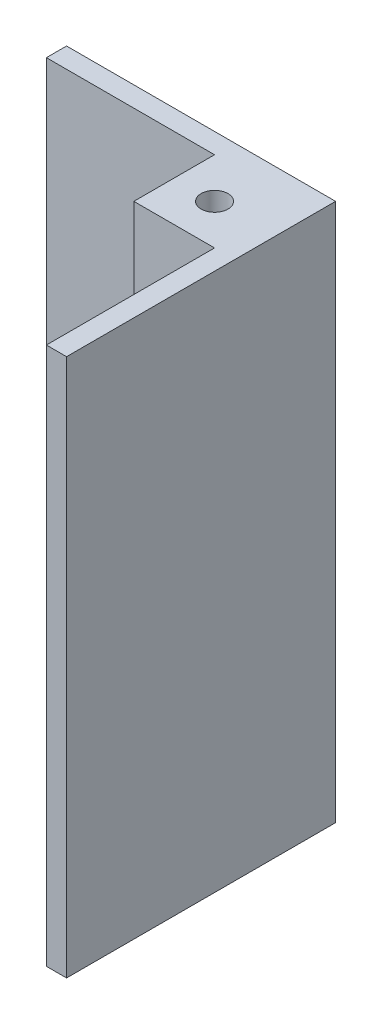
ISO-10303-21;
HEADER;
FILE_DESCRIPTION(('STEP AP214'),'2;1');
FILE_NAME('part.step','',(''),(''),'','','');
FILE_SCHEMA(('AUTOMOTIVE_DESIGN { 1 0 10303 214 1 1 1 1 }'));
ENDSEC;
DATA;
#1=APPLICATION_CONTEXT('core data for automotive mechanical design processes');
#2=APPLICATION_PROTOCOL_DEFINITION('international standard','automotive_design',2000,#1);
#3=PRODUCT_CONTEXT('',#1,'mechanical');
#4=PRODUCT('Part','Part','',(#3));
#5=PRODUCT_RELATED_PRODUCT_CATEGORY('part','',(#4));
#6=PRODUCT_DEFINITION_FORMATION('','',#4);
#7=PRODUCT_DEFINITION_CONTEXT('part definition',#1,'design');
#8=PRODUCT_DEFINITION('design','',#6,#7);
#9=PRODUCT_DEFINITION_SHAPE('','',#8);
#10=(LENGTH_UNIT() NAMED_UNIT(*) SI_UNIT(.MILLI.,.METRE.));
#11=(NAMED_UNIT(*) PLANE_ANGLE_UNIT() SI_UNIT($,.RADIAN.));
#12=(NAMED_UNIT(*) SI_UNIT($,.STERADIAN.) SOLID_ANGLE_UNIT());
#13=UNCERTAINTY_MEASURE_WITH_UNIT(LENGTH_MEASURE(1.E-05),#10,'distance_accuracy_value','');
#14=(GEOMETRIC_REPRESENTATION_CONTEXT(3) GLOBAL_UNCERTAINTY_ASSIGNED_CONTEXT((#13)) GLOBAL_UNIT_ASSIGNED_CONTEXT((#10,
#11,#12)) REPRESENTATION_CONTEXT('',''));
#15=CARTESIAN_POINT('',(0.,0.,0.));
#16=DIRECTION('',(0.,0.,1.));
#17=DIRECTION('',(1.,0.,0.));
#18=AXIS2_PLACEMENT_3D('',#15,#16,#17);
#19=CARTESIAN_POINT('',(0.,40.,0.));
#20=DIRECTION('',(1.,0.,0.));
#21=DIRECTION('',(0.,0.,-1.));
#22=AXIS2_PLACEMENT_3D('',#19,#20,#21);
#23=PLANE('',#22);
#24=DIRECTION('',(0.,0.,1.));
#25=VECTOR('',#24,1.);
#26=CARTESIAN_POINT('',(0.,0.,0.));
#27=LINE('',#26,#25);
#28=CARTESIAN_POINT('',(0.,0.,0.));
#29=VERTEX_POINT('',#28);
#30=CARTESIAN_POINT('',(0.,0.,1.5));
#31=VERTEX_POINT('',#30);
#32=EDGE_CURVE('E109',#29,#31,#27,.T.);
#33=ORIENTED_EDGE('',*,*,#32,.T.);
#34=DIRECTION('',(0.,-1.,0.));
#35=VECTOR('',#34,1.);
#36=CARTESIAN_POINT('',(0.,40.,1.5));
#37=LINE('',#36,#35);
#38=CARTESIAN_POINT('',(0.,40.,1.5));
#39=VERTEX_POINT('',#38);
#40=EDGE_CURVE('E11',#39,#31,#37,.T.);
#41=ORIENTED_EDGE('',*,*,#40,.F.);
#42=DIRECTION('',(0.,0.,1.));
#43=VECTOR('',#42,1.);
#44=CARTESIAN_POINT('',(0.,40.,0.));
#45=LINE('',#44,#43);
#46=CARTESIAN_POINT('',(0.,40.,0.));
#47=VERTEX_POINT('',#46);
#48=EDGE_CURVE('E111',#47,#39,#45,.T.);
#49=ORIENTED_EDGE('',*,*,#48,.F.);
#50=DIRECTION('',(0.,-1.,0.));
#51=VECTOR('',#50,1.);
#52=CARTESIAN_POINT('',(0.,40.,0.));
#53=LINE('',#52,#51);
#54=EDGE_CURVE('E124',#47,#29,#53,.T.);
#55=ORIENTED_EDGE('',*,*,#54,.T.);
#56=EDGE_LOOP('',(#33,#41,#49,#55));
#57=FACE_BOUND('',#56,.T.);
#58=ADVANCED_FACE('F16',(#57),#23,.F.);
#59=CARTESIAN_POINT('',(0.,40.,1.5));
#60=DIRECTION('',(0.,0.,-1.));
#61=DIRECTION('',(-1.,0.,0.));
#62=AXIS2_PLACEMENT_3D('',#59,#60,#61);
#63=PLANE('',#62);
#64=DIRECTION('',(1.,0.,0.));
#65=VECTOR('',#64,1.);
#66=CARTESIAN_POINT('',(0.,0.,1.5));
#67=LINE('',#66,#65);
#68=CARTESIAN_POINT('',(12.5,0.,1.5));
#69=VERTEX_POINT('',#68);
#70=EDGE_CURVE('E127',#31,#69,#67,.T.);
#71=ORIENTED_EDGE('',*,*,#70,.T.);
#72=DIRECTION('',(0.,1.,0.));
#73=VECTOR('',#72,1.);
#74=CARTESIAN_POINT('',(12.5,0.,1.5));
#75=LINE('',#74,#73);
#76=CARTESIAN_POINT('',(12.5,40.,1.5));
#77=VERTEX_POINT('',#76);
#78=EDGE_CURVE('E38',#69,#77,#75,.T.);
#79=ORIENTED_EDGE('',*,*,#78,.T.);
#80=DIRECTION('',(1.,0.,0.));
#81=VECTOR('',#80,1.);
#82=CARTESIAN_POINT('',(0.,40.,1.5));
#83=LINE('',#82,#81);
#84=EDGE_CURVE('E114',#39,#77,#83,.T.);
#85=ORIENTED_EDGE('',*,*,#84,.F.);
#86=ORIENTED_EDGE('',*,*,#40,.T.);
#87=EDGE_LOOP('',(#71,#79,#85,#86));
#88=FACE_BOUND('',#87,.T.);
#89=ADVANCED_FACE('F162',(#88),#63,.F.);
#90=CARTESIAN_POINT('',(18.5,40.,1.5));
#91=DIRECTION('',(1.,0.,0.));
#92=DIRECTION('',(0.,0.,-1.));
#93=AXIS2_PLACEMENT_3D('',#90,#91,#92);
#94=PLANE('',#93);
#95=DIRECTION('',(0.,0.,1.));
#96=VECTOR('',#95,1.);
#97=CARTESIAN_POINT('',(18.5,40.,1.5));
#98=LINE('',#97,#96);
#99=CARTESIAN_POINT('',(18.5,40.,7.5));
#100=VERTEX_POINT('',#99);
#101=CARTESIAN_POINT('',(18.5,40.,20.));
#102=VERTEX_POINT('',#101);
#103=EDGE_CURVE('E30',#100,#102,#98,.T.);
#104=ORIENTED_EDGE('',*,*,#103,.F.);
#105=DIRECTION('',(0.,1.,0.));
#106=VECTOR('',#105,1.);
#107=CARTESIAN_POINT('',(18.5,0.,7.5));
#108=LINE('',#107,#106);
#109=CARTESIAN_POINT('',(18.5,0.,7.5));
#110=VERTEX_POINT('',#109);
#111=EDGE_CURVE('E90',#110,#100,#108,.T.);
#112=ORIENTED_EDGE('',*,*,#111,.F.);
#113=DIRECTION('',(0.,0.,1.));
#114=VECTOR('',#113,1.);
#115=CARTESIAN_POINT('',(18.5,0.,1.5));
#116=LINE('',#115,#114);
#117=CARTESIAN_POINT('',(18.5,0.,20.));
#118=VERTEX_POINT('',#117);
#119=EDGE_CURVE('E100',#110,#118,#116,.T.);
#120=ORIENTED_EDGE('',*,*,#119,.T.);
#121=DIRECTION('',(0.,-1.,0.));
#122=VECTOR('',#121,1.);
#123=CARTESIAN_POINT('',(18.5,40.,20.));
#124=LINE('',#123,#122);
#125=EDGE_CURVE('E23',#102,#118,#124,.T.);
#126=ORIENTED_EDGE('',*,*,#125,.F.);
#127=EDGE_LOOP('',(#104,#112,#120,#126));
#128=FACE_BOUND('',#127,.T.);
#129=ADVANCED_FACE('F170',(#128),#94,.F.);
#130=CARTESIAN_POINT('',(18.5,40.,20.));
#131=DIRECTION('',(0.,0.,-1.));
#132=DIRECTION('',(-1.,0.,0.));
#133=AXIS2_PLACEMENT_3D('',#130,#131,#132);
#134=PLANE('',#133);
#135=DIRECTION('',(1.,0.,0.));
#136=VECTOR('',#135,1.);
#137=CARTESIAN_POINT('',(18.5,0.,20.));
#138=LINE('',#137,#136);
#139=CARTESIAN_POINT('',(20.,0.,20.));
#140=VERTEX_POINT('',#139);
#141=EDGE_CURVE('E130',#118,#140,#138,.T.);
#142=ORIENTED_EDGE('',*,*,#141,.T.);
#143=DIRECTION('',(0.,-1.,0.));
#144=VECTOR('',#143,1.);
#145=CARTESIAN_POINT('',(20.,40.,20.));
#146=LINE('',#145,#144);
#147=CARTESIAN_POINT('',(20.,40.,20.));
#148=VERTEX_POINT('',#147);
#149=EDGE_CURVE('E140',#148,#140,#146,.T.);
#150=ORIENTED_EDGE('',*,*,#149,.F.);
#151=DIRECTION('',(1.,0.,0.));
#152=VECTOR('',#151,1.);
#153=CARTESIAN_POINT('',(18.5,40.,20.));
#154=LINE('',#153,#152);
#155=EDGE_CURVE('E118',#102,#148,#154,.T.);
#156=ORIENTED_EDGE('',*,*,#155,.F.);
#157=ORIENTED_EDGE('',*,*,#125,.T.);
#158=EDGE_LOOP('',(#142,#150,#156,#157));
#159=FACE_BOUND('',#158,.T.);
#160=ADVANCED_FACE('F145',(#159),#134,.F.);
#161=CARTESIAN_POINT('',(20.,40.,0.));
#162=DIRECTION('',(-1.,0.,0.));
#163=DIRECTION('',(0.,0.,1.));
#164=AXIS2_PLACEMENT_3D('',#161,#162,#163);
#165=PLANE('',#164);
#166=DIRECTION('',(0.,0.,-1.));
#167=VECTOR('',#166,1.);
#168=CARTESIAN_POINT('',(20.,0.,0.));
#169=LINE('',#168,#167);
#170=CARTESIAN_POINT('',(20.,0.,0.));
#171=VERTEX_POINT('',#170);
#172=EDGE_CURVE('E132',#140,#171,#169,.T.);
#173=ORIENTED_EDGE('',*,*,#172,.T.);
#174=DIRECTION('',(0.,-1.,0.));
#175=VECTOR('',#174,1.);
#176=CARTESIAN_POINT('',(20.,40.,0.));
#177=LINE('',#176,#175);
#178=CARTESIAN_POINT('',(20.,40.,0.));
#179=VERTEX_POINT('',#178);
#180=EDGE_CURVE('E137',#179,#171,#177,.T.);
#181=ORIENTED_EDGE('',*,*,#180,.F.);
#182=DIRECTION('',(0.,0.,-1.));
#183=VECTOR('',#182,1.);
#184=CARTESIAN_POINT('',(20.,40.,0.));
#185=LINE('',#184,#183);
#186=EDGE_CURVE('E120',#148,#179,#185,.T.);
#187=ORIENTED_EDGE('',*,*,#186,.F.);
#188=ORIENTED_EDGE('',*,*,#149,.T.);
#189=EDGE_LOOP('',(#173,#181,#187,#188));
#190=FACE_BOUND('',#189,.T.);
#191=ADVANCED_FACE('F152',(#190),#165,.F.);
#192=CARTESIAN_POINT('',(0.,40.,0.));
#193=DIRECTION('',(0.,0.,1.));
#194=DIRECTION('',(1.,0.,0.));
#195=AXIS2_PLACEMENT_3D('',#192,#193,#194);
#196=PLANE('',#195);
#197=DIRECTION('',(-1.,0.,0.));
#198=VECTOR('',#197,1.);
#199=CARTESIAN_POINT('',(0.,0.,0.));
#200=LINE('',#199,#198);
#201=EDGE_CURVE('E115',#171,#29,#200,.T.);
#202=ORIENTED_EDGE('',*,*,#201,.T.);
#203=ORIENTED_EDGE('',*,*,#54,.F.);
#204=DIRECTION('',(-1.,0.,0.));
#205=VECTOR('',#204,1.);
#206=CARTESIAN_POINT('',(0.,40.,0.));
#207=LINE('',#206,#205);
#208=EDGE_CURVE('E122',#179,#47,#207,.T.);
#209=ORIENTED_EDGE('',*,*,#208,.F.);
#210=ORIENTED_EDGE('',*,*,#180,.T.);
#211=EDGE_LOOP('',(#202,#203,#209,#210));
#212=FACE_BOUND('',#211,.T.);
#213=ADVANCED_FACE('F156',(#212),#196,.F.);
#214=CARTESIAN_POINT('',(0.,40.,1.5));
#215=DIRECTION('',(0.,1.,0.));
#216=DIRECTION('',(0.,0.,1.));
#217=AXIS2_PLACEMENT_3D('',#214,#215,#216);
#218=PLANE('',#217);
#219=CARTESIAN_POINT('',(15.5,40.,4.5));
#220=DIRECTION('',(0.,1.,0.));
#221=DIRECTION('',(0.,0.,1.));
#222=AXIS2_PLACEMENT_3D('',#219,#220,#221);
#223=CIRCLE('',#222,1.);
#224=CARTESIAN_POINT('',(15.5,40.,5.5));
#225=VERTEX_POINT('',#224);
#226=EDGE_CURVE('E204',#225,#225,#223,.T.);
#227=ORIENTED_EDGE('',*,*,#226,.F.);
#228=EDGE_LOOP('',(#227));
#229=FACE_BOUND('',#228,.T.);
#230=DIRECTION('',(1.,0.,0.));
#231=VECTOR('',#230,1.);
#232=CARTESIAN_POINT('',(18.5,40.,7.5));
#233=LINE('',#232,#231);
#234=CARTESIAN_POINT('',(12.5,40.,7.5));
#235=VERTEX_POINT('',#234);
#236=EDGE_CURVE('E86',#235,#100,#233,.T.);
#237=ORIENTED_EDGE('',*,*,#236,.T.);
#238=ORIENTED_EDGE('',*,*,#103,.T.);
#239=ORIENTED_EDGE('',*,*,#155,.T.);
#240=ORIENTED_EDGE('',*,*,#186,.T.);
#241=ORIENTED_EDGE('',*,*,#208,.T.);
#242=ORIENTED_EDGE('',*,*,#48,.T.);
#243=ORIENTED_EDGE('',*,*,#84,.T.);
#244=DIRECTION('',(0.,0.,1.));
#245=VECTOR('',#244,1.);
#246=CARTESIAN_POINT('',(12.5,40.,1.5));
#247=LINE('',#246,#245);
#248=EDGE_CURVE('E105',#77,#235,#247,.T.);
#249=ORIENTED_EDGE('',*,*,#248,.T.);
#250=EDGE_LOOP('',(#237,#238,#239,#240,#241,#242,#243,#249));
#251=FACE_BOUND('',#250,.T.);
#252=ADVANCED_FACE('F160',(#229,#251),#218,.T.);
#253=CARTESIAN_POINT('',(0.,0.,1.5));
#254=DIRECTION('',(0.,1.,0.));
#255=DIRECTION('',(0.,0.,1.));
#256=AXIS2_PLACEMENT_3D('',#253,#254,#255);
#257=PLANE('',#256);
#258=CARTESIAN_POINT('',(15.5,0.,4.5));
#259=DIRECTION('',(0.,1.,0.));
#260=DIRECTION('',(0.,0.,1.));
#261=AXIS2_PLACEMENT_3D('',#258,#259,#260);
#262=CIRCLE('',#261,1.);
#263=CARTESIAN_POINT('',(15.5,0.,5.5));
#264=VERTEX_POINT('',#263);
#265=EDGE_CURVE('E107',#264,#264,#262,.T.);
#266=ORIENTED_EDGE('',*,*,#265,.T.);
#267=EDGE_LOOP('',(#266));
#268=FACE_BOUND('',#267,.T.);
#269=ORIENTED_EDGE('',*,*,#119,.F.);
#270=DIRECTION('',(1.,0.,0.));
#271=VECTOR('',#270,1.);
#272=CARTESIAN_POINT('',(18.5,0.,7.5));
#273=LINE('',#272,#271);
#274=CARTESIAN_POINT('',(12.5,0.,7.5));
#275=VERTEX_POINT('',#274);
#276=EDGE_CURVE('E84',#275,#110,#273,.T.);
#277=ORIENTED_EDGE('',*,*,#276,.F.);
#278=DIRECTION('',(0.,0.,1.));
#279=VECTOR('',#278,1.);
#280=CARTESIAN_POINT('',(12.5,0.,1.5));
#281=LINE('',#280,#279);
#282=EDGE_CURVE('E93',#69,#275,#281,.T.);
#283=ORIENTED_EDGE('',*,*,#282,.F.);
#284=ORIENTED_EDGE('',*,*,#70,.F.);
#285=ORIENTED_EDGE('',*,*,#32,.F.);
#286=ORIENTED_EDGE('',*,*,#201,.F.);
#287=ORIENTED_EDGE('',*,*,#172,.F.);
#288=ORIENTED_EDGE('',*,*,#141,.F.);
#289=EDGE_LOOP('',(#269,#277,#283,#284,#285,#286,#287,#288));
#290=FACE_BOUND('',#289,.T.);
#291=ADVANCED_FACE('F98',(#268,#290),#257,.F.);
#292=CARTESIAN_POINT('',(18.5,0.,7.5));
#293=DIRECTION('',(0.,0.,1.));
#294=DIRECTION('',(1.,0.,0.));
#295=AXIS2_PLACEMENT_3D('',#292,#293,#294);
#296=PLANE('',#295);
#297=ORIENTED_EDGE('',*,*,#236,.F.);
#298=DIRECTION('',(0.,1.,0.));
#299=VECTOR('',#298,1.);
#300=CARTESIAN_POINT('',(12.5,0.,7.5));
#301=LINE('',#300,#299);
#302=EDGE_CURVE('E80',#275,#235,#301,.T.);
#303=ORIENTED_EDGE('',*,*,#302,.F.);
#304=ORIENTED_EDGE('',*,*,#276,.T.);
#305=ORIENTED_EDGE('',*,*,#111,.T.);
#306=EDGE_LOOP('',(#297,#303,#304,#305));
#307=FACE_BOUND('',#306,.T.);
#308=ADVANCED_FACE('F82',(#307),#296,.T.);
#309=CARTESIAN_POINT('',(12.5,0.,1.5));
#310=DIRECTION('',(-1.,0.,0.));
#311=DIRECTION('',(0.,0.,1.));
#312=AXIS2_PLACEMENT_3D('',#309,#310,#311);
#313=PLANE('',#312);
#314=ORIENTED_EDGE('',*,*,#248,.F.);
#315=ORIENTED_EDGE('',*,*,#78,.F.);
#316=ORIENTED_EDGE('',*,*,#282,.T.);
#317=ORIENTED_EDGE('',*,*,#302,.T.);
#318=EDGE_LOOP('',(#314,#315,#316,#317));
#319=FACE_BOUND('',#318,.T.);
#320=ADVANCED_FACE('F94',(#319),#313,.T.);
#321=CARTESIAN_POINT('',(15.5,0.,4.5));
#322=DIRECTION('',(0.,1.,0.));
#323=DIRECTION('',(0.,0.,1.));
#324=AXIS2_PLACEMENT_3D('',#321,#322,#323);
#325=CYLINDRICAL_SURFACE('',#324,1.);
#326=ORIENTED_EDGE('',*,*,#265,.F.);
#327=EDGE_LOOP('',(#326));
#328=FACE_BOUND('',#327,.T.);
#329=ORIENTED_EDGE('',*,*,#226,.T.);
#330=EDGE_LOOP('',(#329));
#331=FACE_BOUND('',#330,.T.);
#332=ADVANCED_FACE('F191',(#328,#331),#325,.F.);
#333=CLOSED_SHELL('',(#58,#89,#129,#160,#191,#213,#252,#291,#308,#320,#332));
#334=MANIFOLD_SOLID_BREP('B1',#333);
#335=ADVANCED_BREP_SHAPE_REPRESENTATION('',(#18,#334),#14);
#336=SHAPE_DEFINITION_REPRESENTATION(#9,#335);
ENDSEC;
END-ISO-10303-21;
